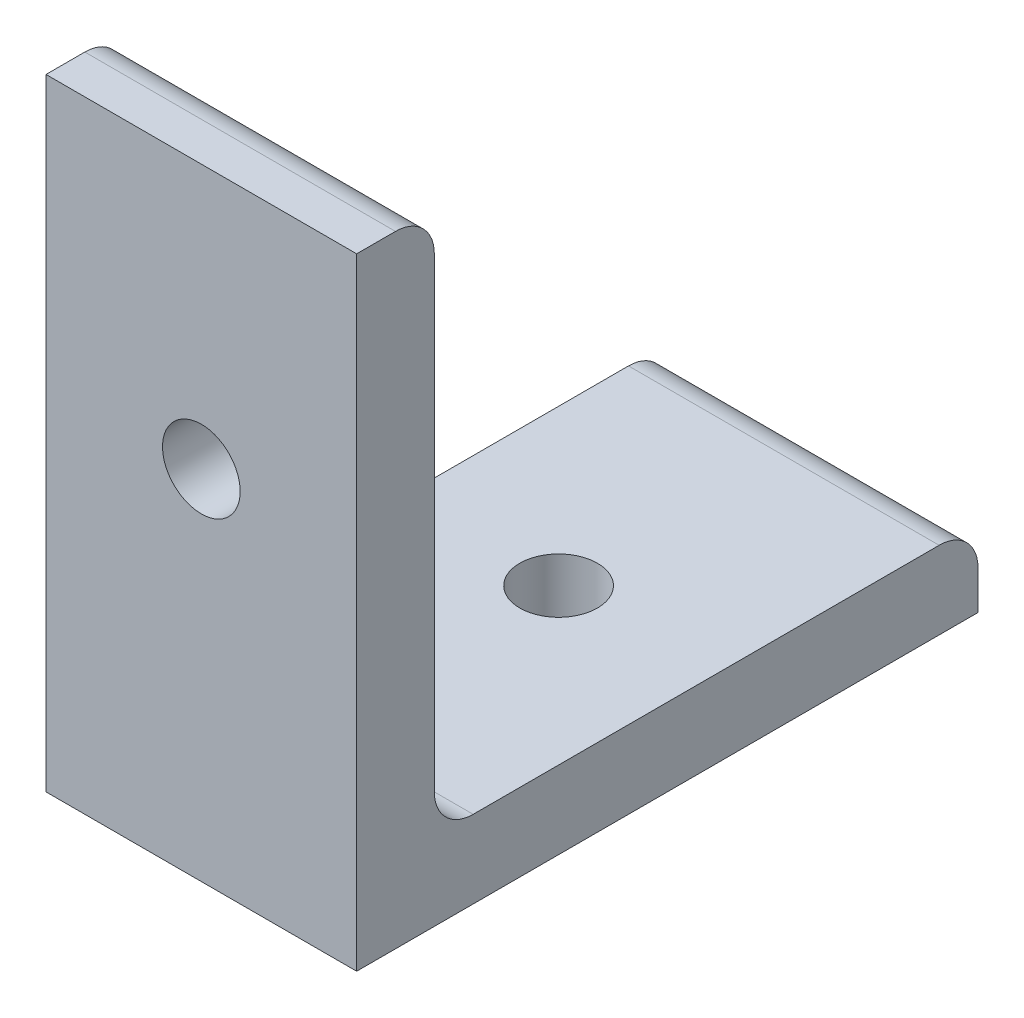
ISO-10303-21;
HEADER;
FILE_DESCRIPTION(('STEP AP214'),'2;1');
FILE_NAME('part.step','',(''),(''),'','','');
FILE_SCHEMA(('AUTOMOTIVE_DESIGN { 1 0 10303 214 1 1 1 1 }'));
ENDSEC;
DATA;
#1=APPLICATION_CONTEXT('core data for automotive mechanical design processes');
#2=APPLICATION_PROTOCOL_DEFINITION('international standard','automotive_design',2000,#1);
#3=PRODUCT_CONTEXT('',#1,'mechanical');
#4=PRODUCT('Part','Part','',(#3));
#5=PRODUCT_RELATED_PRODUCT_CATEGORY('part','',(#4));
#6=PRODUCT_DEFINITION_FORMATION('','',#4);
#7=PRODUCT_DEFINITION_CONTEXT('part definition',#1,'design');
#8=PRODUCT_DEFINITION('design','',#6,#7);
#9=PRODUCT_DEFINITION_SHAPE('','',#8);
#10=(LENGTH_UNIT() NAMED_UNIT(*) SI_UNIT(.MILLI.,.METRE.));
#11=(NAMED_UNIT(*) PLANE_ANGLE_UNIT() SI_UNIT($,.RADIAN.));
#12=(NAMED_UNIT(*) SI_UNIT($,.STERADIAN.) SOLID_ANGLE_UNIT());
#13=UNCERTAINTY_MEASURE_WITH_UNIT(LENGTH_MEASURE(1.E-05),#10,'distance_accuracy_value','');
#14=(GEOMETRIC_REPRESENTATION_CONTEXT(3) GLOBAL_UNCERTAINTY_ASSIGNED_CONTEXT((#13)) GLOBAL_UNIT_ASSIGNED_CONTEXT((#10,
#11,#12)) REPRESENTATION_CONTEXT('',''));
#15=CARTESIAN_POINT('',(0.,0.,0.));
#16=DIRECTION('',(0.,0.,1.));
#17=DIRECTION('',(1.,0.,0.));
#18=AXIS2_PLACEMENT_3D('',#15,#16,#17);
#19=CARTESIAN_POINT('',(25.4,50.8,0.));
#20=DIRECTION('',(0.,0.,-1.));
#21=DIRECTION('',(-1.,0.,0.));
#22=AXIS2_PLACEMENT_3D('',#19,#20,#21);
#23=PLANE('',#22);
#24=CARTESIAN_POINT('',(12.7,29.21,0.));
#25=DIRECTION('',(0.,0.,1.));
#26=DIRECTION('',(1.,0.,0.));
#27=AXIS2_PLACEMENT_3D('',#24,#25,#26);
#28=CIRCLE('',#27,3.175);
#29=CARTESIAN_POINT('',(15.875,29.21,0.));
#30=VERTEX_POINT('',#29);
#31=EDGE_CURVE('E187',#30,#30,#28,.T.);
#32=ORIENTED_EDGE('',*,*,#31,.F.);
#33=EDGE_LOOP('',(#32));
#34=FACE_BOUND('',#33,.T.);
#35=DIRECTION('',(0.,-1.,0.));
#36=VECTOR('',#35,1.);
#37=CARTESIAN_POINT('',(0.,50.8,0.));
#38=LINE('',#37,#36);
#39=CARTESIAN_POINT('',(0.,50.8,0.));
#40=VERTEX_POINT('',#39);
#41=CARTESIAN_POINT('',(0.,0.,0.));
#42=VERTEX_POINT('',#41);
#43=EDGE_CURVE('E125',#40,#42,#38,.T.);
#44=ORIENTED_EDGE('',*,*,#43,.T.);
#45=DIRECTION('',(-1.,0.,0.));
#46=VECTOR('',#45,1.);
#47=CARTESIAN_POINT('',(25.4,0.,0.));
#48=LINE('',#47,#46);
#49=CARTESIAN_POINT('',(25.4,0.,0.));
#50=VERTEX_POINT('',#49);
#51=EDGE_CURVE('E107',#50,#42,#48,.T.);
#52=ORIENTED_EDGE('',*,*,#51,.F.);
#53=DIRECTION('',(0.,-1.,0.));
#54=VECTOR('',#53,1.);
#55=CARTESIAN_POINT('',(25.4,50.8,0.));
#56=LINE('',#55,#54);
#57=CARTESIAN_POINT('',(25.4,50.8,0.));
#58=VERTEX_POINT('',#57);
#59=EDGE_CURVE('E112',#58,#50,#56,.T.);
#60=ORIENTED_EDGE('',*,*,#59,.F.);
#61=DIRECTION('',(-1.,0.,0.));
#62=VECTOR('',#61,1.);
#63=CARTESIAN_POINT('',(25.4,50.8,0.));
#64=LINE('',#63,#62);
#65=EDGE_CURVE('E131',#58,#40,#64,.T.);
#66=ORIENTED_EDGE('',*,*,#65,.T.);
#67=EDGE_LOOP('',(#44,#52,#60,#66));
#68=FACE_BOUND('',#67,.T.);
#69=ADVANCED_FACE('F32',(#34,#68),#23,.F.);
#70=CARTESIAN_POINT('',(25.4,0.,0.));
#71=DIRECTION('',(0.,1.,0.));
#72=DIRECTION('',(0.,0.,1.));
#73=AXIS2_PLACEMENT_3D('',#70,#71,#72);
#74=PLANE('',#73);
#75=CARTESIAN_POINT('',(12.7,0.,-29.21));
#76=DIRECTION('',(0.,1.,0.));
#77=DIRECTION('',(0.,0.,1.));
#78=AXIS2_PLACEMENT_3D('',#75,#76,#77);
#79=CIRCLE('',#78,3.175);
#80=CARTESIAN_POINT('',(12.7,0.,-26.035));
#81=VERTEX_POINT('',#80);
#82=EDGE_CURVE('E190',#81,#81,#79,.F.);
#83=ORIENTED_EDGE('',*,*,#82,.F.);
#84=EDGE_LOOP('',(#83));
#85=FACE_BOUND('',#84,.T.);
#86=DIRECTION('',(0.,0.,-1.));
#87=VECTOR('',#86,1.);
#88=CARTESIAN_POINT('',(0.,0.,0.));
#89=LINE('',#88,#87);
#90=CARTESIAN_POINT('',(0.,0.,-50.8));
#91=VERTEX_POINT('',#90);
#92=EDGE_CURVE('E172',#42,#91,#89,.T.);
#93=ORIENTED_EDGE('',*,*,#92,.T.);
#94=DIRECTION('',(-1.,0.,0.));
#95=VECTOR('',#94,1.);
#96=CARTESIAN_POINT('',(25.4,0.,-50.8));
#97=LINE('',#96,#95);
#98=CARTESIAN_POINT('',(25.4,0.,-50.8));
#99=VERTEX_POINT('',#98);
#100=EDGE_CURVE('E110',#99,#91,#97,.T.);
#101=ORIENTED_EDGE('',*,*,#100,.F.);
#102=DIRECTION('',(0.,0.,-1.));
#103=VECTOR('',#102,1.);
#104=CARTESIAN_POINT('',(25.4,0.,0.));
#105=LINE('',#104,#103);
#106=EDGE_CURVE('E103',#50,#99,#105,.T.);
#107=ORIENTED_EDGE('',*,*,#106,.F.);
#108=ORIENTED_EDGE('',*,*,#51,.T.);
#109=EDGE_LOOP('',(#93,#101,#107,#108));
#110=FACE_BOUND('',#109,.T.);
#111=ADVANCED_FACE('F105',(#85,#110),#74,.F.);
#112=CARTESIAN_POINT('',(25.4,0.,-50.8));
#113=DIRECTION('',(0.,0.,1.));
#114=DIRECTION('',(1.,0.,0.));
#115=AXIS2_PLACEMENT_3D('',#112,#113,#114);
#116=PLANE('',#115);
#117=DIRECTION('',(0.,1.,0.));
#118=VECTOR('',#117,1.);
#119=CARTESIAN_POINT('',(0.,0.,-50.8));
#120=LINE('',#119,#118);
#121=CARTESIAN_POINT('',(0.,3.175,-50.8));
#122=VERTEX_POINT('',#121);
#123=EDGE_CURVE('E168',#91,#122,#120,.T.);
#124=ORIENTED_EDGE('',*,*,#123,.T.);
#125=DIRECTION('',(-1.,0.,0.));
#126=VECTOR('',#125,1.);
#127=CARTESIAN_POINT('',(25.4,3.175,-50.8));
#128=LINE('',#127,#126);
#129=CARTESIAN_POINT('',(25.4,3.175,-50.8));
#130=VERTEX_POINT('',#129);
#131=EDGE_CURVE('E11',#122,#130,#128,.F.);
#132=ORIENTED_EDGE('',*,*,#131,.T.);
#133=DIRECTION('',(0.,1.,0.));
#134=VECTOR('',#133,1.);
#135=CARTESIAN_POINT('',(25.4,0.,-50.8));
#136=LINE('',#135,#134);
#137=EDGE_CURVE('E111',#99,#130,#136,.T.);
#138=ORIENTED_EDGE('',*,*,#137,.F.);
#139=ORIENTED_EDGE('',*,*,#100,.T.);
#140=EDGE_LOOP('',(#124,#132,#138,#139));
#141=FACE_BOUND('',#140,.T.);
#142=ADVANCED_FACE('F182',(#141),#116,.F.);
#143=CARTESIAN_POINT('',(25.4,6.35,-50.8));
#144=DIRECTION('',(0.,-1.,0.));
#145=DIRECTION('',(0.,0.,-1.));
#146=AXIS2_PLACEMENT_3D('',#143,#144,#145);
#147=PLANE('',#146);
#148=CARTESIAN_POINT('',(12.7,6.35,-29.21));
#149=DIRECTION('',(0.,1.,0.));
#150=DIRECTION('',(0.,0.,1.));
#151=AXIS2_PLACEMENT_3D('',#148,#149,#150);
#152=CIRCLE('',#151,3.175);
#153=CARTESIAN_POINT('',(12.7,6.35,-26.035));
#154=VERTEX_POINT('',#153);
#155=EDGE_CURVE('E193',#154,#154,#152,.T.);
#156=ORIENTED_EDGE('',*,*,#155,.F.);
#157=EDGE_LOOP('',(#156));
#158=FACE_BOUND('',#157,.T.);
#159=DIRECTION('',(0.,0.,1.));
#160=VECTOR('',#159,1.);
#161=CARTESIAN_POINT('',(25.4,6.35,-50.8));
#162=LINE('',#161,#160);
#163=CARTESIAN_POINT('',(25.4,6.35,-47.625));
#164=VERTEX_POINT('',#163);
#165=CARTESIAN_POINT('',(25.4,6.34999999999999,-9.52500000000001));
#166=VERTEX_POINT('',#165);
#167=EDGE_CURVE('E159',#164,#166,#162,.T.);
#168=ORIENTED_EDGE('',*,*,#167,.F.);
#169=DIRECTION('',(-1.,0.,0.));
#170=VECTOR('',#169,1.);
#171=CARTESIAN_POINT('',(25.4,6.35,-47.625));
#172=LINE('',#171,#170);
#173=CARTESIAN_POINT('',(0.,6.35,-47.625));
#174=VERTEX_POINT('',#173);
#175=EDGE_CURVE('E40',#164,#174,#172,.T.);
#176=ORIENTED_EDGE('',*,*,#175,.T.);
#177=DIRECTION('',(0.,0.,1.));
#178=VECTOR('',#177,1.);
#179=CARTESIAN_POINT('',(0.,6.35,-50.8));
#180=LINE('',#179,#178);
#181=CARTESIAN_POINT('',(0.,6.34999999999999,-9.52500000000001));
#182=VERTEX_POINT('',#181);
#183=EDGE_CURVE('E158',#174,#182,#180,.T.);
#184=ORIENTED_EDGE('',*,*,#183,.T.);
#185=DIRECTION('',(-1.,0.,0.));
#186=VECTOR('',#185,1.);
#187=CARTESIAN_POINT('',(25.4,6.34999999999999,-9.52500000000001));
#188=LINE('',#187,#186);
#189=EDGE_CURVE('E129',#182,#166,#188,.F.);
#190=ORIENTED_EDGE('',*,*,#189,.T.);
#191=EDGE_LOOP('',(#168,#176,#184,#190));
#192=FACE_BOUND('',#191,.T.);
#193=ADVANCED_FACE('F157',(#158,#192),#147,.F.);
#194=CARTESIAN_POINT('',(25.4,6.34999999999999,-6.35000000000001));
#195=DIRECTION('',(0.,0.,1.));
#196=DIRECTION('',(0.,-1.,0.));
#197=AXIS2_PLACEMENT_3D('',#194,#195,#196);
#198=PLANE('',#197);
#199=CARTESIAN_POINT('',(12.7,29.21,-6.35000000000001));
#200=DIRECTION('',(0.,0.,1.));
#201=DIRECTION('',(0.,-1.,0.));
#202=AXIS2_PLACEMENT_3D('',#199,#200,#201);
#203=CIRCLE('',#202,3.175);
#204=CARTESIAN_POINT('',(12.7,26.035,-6.35000000000001));
#205=VERTEX_POINT('',#204);
#206=EDGE_CURVE('E181',#205,#205,#203,.F.);
#207=ORIENTED_EDGE('',*,*,#206,.F.);
#208=EDGE_LOOP('',(#207));
#209=FACE_BOUND('',#208,.T.);
#210=DIRECTION('',(0.,1.,0.));
#211=VECTOR('',#210,1.);
#212=CARTESIAN_POINT('',(0.,6.34999999999999,-6.35000000000001));
#213=LINE('',#212,#211);
#214=CARTESIAN_POINT('',(0.,9.52499999999999,-6.35000000000001));
#215=VERTEX_POINT('',#214);
#216=CARTESIAN_POINT('',(0.,47.625,-6.35));
#217=VERTEX_POINT('',#216);
#218=EDGE_CURVE('E167',#215,#217,#213,.T.);
#219=ORIENTED_EDGE('',*,*,#218,.T.);
#220=DIRECTION('',(-1.,0.,0.));
#221=VECTOR('',#220,1.);
#222=CARTESIAN_POINT('',(25.4,47.625,-6.35));
#223=LINE('',#222,#221);
#224=CARTESIAN_POINT('',(25.4,47.625,-6.35));
#225=VERTEX_POINT('',#224);
#226=EDGE_CURVE('E149',#217,#225,#223,.F.);
#227=ORIENTED_EDGE('',*,*,#226,.T.);
#228=DIRECTION('',(0.,1.,0.));
#229=VECTOR('',#228,1.);
#230=CARTESIAN_POINT('',(25.4,6.34999999999999,-6.35000000000001));
#231=LINE('',#230,#229);
#232=CARTESIAN_POINT('',(25.4,9.52499999999999,-6.35000000000001));
#233=VERTEX_POINT('',#232);
#234=EDGE_CURVE('E176',#233,#225,#231,.T.);
#235=ORIENTED_EDGE('',*,*,#234,.F.);
#236=DIRECTION('',(-1.,0.,0.));
#237=VECTOR('',#236,1.);
#238=CARTESIAN_POINT('',(0.,9.52499999999999,-6.35000000000001));
#239=LINE('',#238,#237);
#240=EDGE_CURVE('E126',#233,#215,#239,.T.);
#241=ORIENTED_EDGE('',*,*,#240,.T.);
#242=EDGE_LOOP('',(#219,#227,#235,#241));
#243=FACE_BOUND('',#242,.T.);
#244=ADVANCED_FACE('F201',(#209,#243),#198,.F.);
#245=CARTESIAN_POINT('',(25.4,50.8,-6.35));
#246=DIRECTION('',(0.,-1.,0.));
#247=DIRECTION('',(0.,0.,-1.));
#248=AXIS2_PLACEMENT_3D('',#245,#246,#247);
#249=PLANE('',#248);
#250=DIRECTION('',(0.,0.,1.));
#251=VECTOR('',#250,1.);
#252=CARTESIAN_POINT('',(25.4,50.8,-6.35));
#253=LINE('',#252,#251);
#254=CARTESIAN_POINT('',(25.4,50.8,-3.17500000000001));
#255=VERTEX_POINT('',#254);
#256=EDGE_CURVE('E118',#255,#58,#253,.T.);
#257=ORIENTED_EDGE('',*,*,#256,.F.);
#258=DIRECTION('',(-1.,0.,0.));
#259=VECTOR('',#258,1.);
#260=CARTESIAN_POINT('',(25.4,50.8,-3.17500000000001));
#261=LINE('',#260,#259);
#262=CARTESIAN_POINT('',(0.,50.8,-3.17500000000001));
#263=VERTEX_POINT('',#262);
#264=EDGE_CURVE('E142',#255,#263,#261,.T.);
#265=ORIENTED_EDGE('',*,*,#264,.T.);
#266=DIRECTION('',(0.,0.,1.));
#267=VECTOR('',#266,1.);
#268=CARTESIAN_POINT('',(0.,50.8,-6.35));
#269=LINE('',#268,#267);
#270=EDGE_CURVE('E122',#263,#40,#269,.T.);
#271=ORIENTED_EDGE('',*,*,#270,.T.);
#272=ORIENTED_EDGE('',*,*,#65,.F.);
#273=EDGE_LOOP('',(#257,#265,#271,#272));
#274=FACE_BOUND('',#273,.T.);
#275=ADVANCED_FACE('F207',(#274),#249,.F.);
#276=CARTESIAN_POINT('',(25.4,0.,0.));
#277=DIRECTION('',(1.,0.,0.));
#278=DIRECTION('',(0.,0.,-1.));
#279=AXIS2_PLACEMENT_3D('',#276,#277,#278);
#280=PLANE('',#279);
#281=ORIENTED_EDGE('',*,*,#234,.T.);
#282=CARTESIAN_POINT('',(25.4,47.625,-3.17500000000001));
#283=DIRECTION('',(1.,0.,0.));
#284=DIRECTION('',(0.,0.,-1.));
#285=AXIS2_PLACEMENT_3D('',#282,#283,#284);
#286=CIRCLE('',#285,3.175);
#287=EDGE_CURVE('E152',#225,#255,#286,.T.);
#288=ORIENTED_EDGE('',*,*,#287,.T.);
#289=ORIENTED_EDGE('',*,*,#256,.T.);
#290=ORIENTED_EDGE('',*,*,#59,.T.);
#291=ORIENTED_EDGE('',*,*,#106,.T.);
#292=ORIENTED_EDGE('',*,*,#137,.T.);
#293=CARTESIAN_POINT('',(25.4,3.175,-47.625));
#294=DIRECTION('',(1.,0.,0.));
#295=DIRECTION('',(0.,0.,-1.));
#296=AXIS2_PLACEMENT_3D('',#293,#294,#295);
#297=CIRCLE('',#296,3.175);
#298=EDGE_CURVE('E47',#130,#164,#297,.T.);
#299=ORIENTED_EDGE('',*,*,#298,.T.);
#300=ORIENTED_EDGE('',*,*,#167,.T.);
#301=CARTESIAN_POINT('',(25.4,9.52499999999999,-9.52500000000001));
#302=DIRECTION('',(1.,0.,0.));
#303=DIRECTION('',(0.,0.,-1.));
#304=AXIS2_PLACEMENT_3D('',#301,#302,#303);
#305=CIRCLE('',#304,3.175);
#306=EDGE_CURVE('E140',#166,#233,#305,.F.);
#307=ORIENTED_EDGE('',*,*,#306,.T.);
#308=EDGE_LOOP('',(#281,#288,#289,#290,#291,#292,#299,#300,#307));
#309=FACE_BOUND('',#308,.T.);
#310=ADVANCED_FACE('F116',(#309),#280,.T.);
#311=CARTESIAN_POINT('',(0.,0.,0.));
#312=DIRECTION('',(1.,0.,0.));
#313=DIRECTION('',(0.,0.,-1.));
#314=AXIS2_PLACEMENT_3D('',#311,#312,#313);
#315=PLANE('',#314);
#316=ORIENTED_EDGE('',*,*,#270,.F.);
#317=CARTESIAN_POINT('',(0.,47.625,-3.17500000000001));
#318=DIRECTION('',(1.,0.,0.));
#319=DIRECTION('',(0.,0.,-1.));
#320=AXIS2_PLACEMENT_3D('',#317,#318,#319);
#321=CIRCLE('',#320,3.175);
#322=EDGE_CURVE('E147',#263,#217,#321,.F.);
#323=ORIENTED_EDGE('',*,*,#322,.T.);
#324=ORIENTED_EDGE('',*,*,#218,.F.);
#325=CARTESIAN_POINT('',(0.,9.52499999999999,-9.52500000000001));
#326=DIRECTION('',(1.,0.,0.));
#327=DIRECTION('',(0.,0.,-1.));
#328=AXIS2_PLACEMENT_3D('',#325,#326,#327);
#329=CIRCLE('',#328,3.175);
#330=EDGE_CURVE('E137',#215,#182,#329,.T.);
#331=ORIENTED_EDGE('',*,*,#330,.T.);
#332=ORIENTED_EDGE('',*,*,#183,.F.);
#333=CARTESIAN_POINT('',(0.,3.175,-47.625));
#334=DIRECTION('',(1.,0.,0.));
#335=DIRECTION('',(0.,0.,-1.));
#336=AXIS2_PLACEMENT_3D('',#333,#334,#335);
#337=CIRCLE('',#336,3.175);
#338=EDGE_CURVE('E145',#174,#122,#337,.F.);
#339=ORIENTED_EDGE('',*,*,#338,.T.);
#340=ORIENTED_EDGE('',*,*,#123,.F.);
#341=ORIENTED_EDGE('',*,*,#92,.F.);
#342=ORIENTED_EDGE('',*,*,#43,.F.);
#343=EDGE_LOOP('',(#316,#323,#324,#331,#332,#339,#340,#341,#342));
#344=FACE_BOUND('',#343,.T.);
#345=ADVANCED_FACE('F163',(#344),#315,.F.);
#346=CARTESIAN_POINT('',(12.7,29.21,-50.801));
#347=DIRECTION('',(0.,0.,1.));
#348=DIRECTION('',(1.,0.,0.));
#349=AXIS2_PLACEMENT_3D('',#346,#347,#348);
#350=CYLINDRICAL_SURFACE('',#349,3.175);
#351=ORIENTED_EDGE('',*,*,#31,.T.);
#352=EDGE_LOOP('',(#351));
#353=FACE_BOUND('',#352,.T.);
#354=ORIENTED_EDGE('',*,*,#206,.T.);
#355=EDGE_LOOP('',(#354));
#356=FACE_BOUND('',#355,.T.);
#357=ADVANCED_FACE('F246',(#353,#356),#350,.F.);
#358=CARTESIAN_POINT('',(12.7,-0.00100000000000273,-29.21));
#359=DIRECTION('',(0.,1.,0.));
#360=DIRECTION('',(0.,0.,1.));
#361=AXIS2_PLACEMENT_3D('',#358,#359,#360);
#362=CYLINDRICAL_SURFACE('',#361,3.175);
#363=CARTESIAN_POINT('',(12.7,6.35,-26.035));
#364=CARTESIAN_POINT('',(12.7,6.28385416666666,-26.035));
#365=CARTESIAN_POINT('',(12.7,6.21770833333333,-26.035));
#366=CARTESIAN_POINT('',(12.7,6.08541666666666,-26.035));
#367=CARTESIAN_POINT('',(12.7,6.01927083333333,-26.035));
#368=CARTESIAN_POINT('',(12.7,5.88697916666666,-26.035));
#369=CARTESIAN_POINT('',(12.7,5.82083333333333,-26.035));
#370=CARTESIAN_POINT('',(12.7,5.68854166666666,-26.035));
#371=CARTESIAN_POINT('',(12.7,5.62239583333333,-26.035));
#372=CARTESIAN_POINT('',(12.7,5.49010416666666,-26.035));
#373=CARTESIAN_POINT('',(12.7,5.42395833333333,-26.035));
#374=CARTESIAN_POINT('',(12.7,5.29166666666666,-26.035));
#375=CARTESIAN_POINT('',(12.7,5.22552083333333,-26.035));
#376=CARTESIAN_POINT('',(12.7,5.09322916666666,-26.035));
#377=CARTESIAN_POINT('',(12.7,5.02708333333333,-26.035));
#378=CARTESIAN_POINT('',(12.7,4.89479166666666,-26.035));
#379=CARTESIAN_POINT('',(12.7,4.82864583333333,-26.035));
#380=CARTESIAN_POINT('',(12.7,4.69635416666666,-26.035));
#381=CARTESIAN_POINT('',(12.7,4.63020833333333,-26.035));
#382=CARTESIAN_POINT('',(12.7,4.49791666666666,-26.035));
#383=CARTESIAN_POINT('',(12.7,4.43177083333333,-26.035));
#384=CARTESIAN_POINT('',(12.7,4.29947916666666,-26.035));
#385=CARTESIAN_POINT('',(12.7,4.23333333333333,-26.035));
#386=CARTESIAN_POINT('',(12.7,4.10104166666666,-26.035));
#387=CARTESIAN_POINT('',(12.7,4.03489583333333,-26.035));
#388=CARTESIAN_POINT('',(12.7,3.90260416666666,-26.035));
#389=CARTESIAN_POINT('',(12.7,3.83645833333333,-26.035));
#390=CARTESIAN_POINT('',(12.7,3.70416666666666,-26.035));
#391=CARTESIAN_POINT('',(12.7,3.63802083333333,-26.035));
#392=CARTESIAN_POINT('',(12.7,3.50572916666666,-26.035));
#393=CARTESIAN_POINT('',(12.7,3.43958333333333,-26.035));
#394=CARTESIAN_POINT('',(12.7,3.30729166666666,-26.035));
#395=CARTESIAN_POINT('',(12.7,3.24114583333333,-26.035));
#396=CARTESIAN_POINT('',(12.7,3.10885416666666,-26.035));
#397=CARTESIAN_POINT('',(12.7,3.04270833333333,-26.035));
#398=CARTESIAN_POINT('',(12.7,2.91041666666666,-26.035));
#399=CARTESIAN_POINT('',(12.7,2.84427083333333,-26.035));
#400=CARTESIAN_POINT('',(12.7,2.71197916666666,-26.035));
#401=CARTESIAN_POINT('',(12.7,2.64583333333333,-26.035));
#402=CARTESIAN_POINT('',(12.7,2.51354166666666,-26.035));
#403=CARTESIAN_POINT('',(12.7,2.44739583333333,-26.035));
#404=CARTESIAN_POINT('',(12.7,2.31510416666666,-26.035));
#405=CARTESIAN_POINT('',(12.7,2.24895833333333,-26.035));
#406=CARTESIAN_POINT('',(12.7,2.11666666666666,-26.035));
#407=CARTESIAN_POINT('',(12.7,2.05052083333333,-26.035));
#408=CARTESIAN_POINT('',(12.7,1.91822916666667,-26.035));
#409=CARTESIAN_POINT('',(12.7,1.85208333333333,-26.035));
#410=CARTESIAN_POINT('',(12.7,1.71979166666667,-26.035));
#411=CARTESIAN_POINT('',(12.7,1.65364583333333,-26.035));
#412=CARTESIAN_POINT('',(12.7,1.52135416666666,-26.035));
#413=CARTESIAN_POINT('',(12.7,1.45520833333333,-26.035));
#414=CARTESIAN_POINT('',(12.7,1.32291666666666,-26.035));
#415=CARTESIAN_POINT('',(12.7,1.25677083333333,-26.035));
#416=CARTESIAN_POINT('',(12.7,1.12447916666667,-26.035));
#417=CARTESIAN_POINT('',(12.7,1.05833333333333,-26.035));
#418=CARTESIAN_POINT('',(12.7,0.926041666666665,-26.035));
#419=CARTESIAN_POINT('',(12.7,0.859895833333332,-26.035));
#420=CARTESIAN_POINT('',(12.7,0.727604166666666,-26.035));
#421=CARTESIAN_POINT('',(12.7,0.661458333333332,-26.035));
#422=CARTESIAN_POINT('',(12.7,0.529166666666666,-26.035));
#423=CARTESIAN_POINT('',(12.7,0.463020833333332,-26.035));
#424=CARTESIAN_POINT('',(12.7,0.330729166666666,-26.035));
#425=CARTESIAN_POINT('',(12.7,0.264583333333333,-26.035));
#426=CARTESIAN_POINT('',(12.7,0.132291666666666,-26.035));
#427=CARTESIAN_POINT('',(12.7,0.0661458333333329,-26.035));
#428=CARTESIAN_POINT('',(12.7,0.,-26.035));
#429=B_SPLINE_CURVE_WITH_KNOTS('',3,(#363,#364,#365,#366,#367,#368,#369,#370,#371,#372,#373,
#374,#375,#376,#377,#378,#379,#380,#381,#382,#383,#384,#385,#386,#387,#388,#389,#390,#391,#392,
#393,#394,#395,#396,#397,#398,#399,#400,#401,#402,#403,#404,#405,#406,#407,#408,#409,#410,#411,
#412,#413,#414,#415,#416,#417,#418,#419,#420,#421,#422,#423,#424,#425,#426,#427,#428),
.UNSPECIFIED.,.F.,.F.,(4,2,2,2,2,2,2,2,2,2,2,2,2,2,2,2,2,2,2,2,2,2,2,2,2,2,2,2,2,2,2,2,4),(0.,
0.1984375,0.396875,0.595312499999999,0.793749999999999,0.992187499999999,1.190625,1.3890625,
1.5875,1.7859375,1.984375,2.1828125,2.38125,2.5796875,2.778125,2.9765625,3.175,3.3734375,
3.571875,3.7703125,3.96875,4.1671875,4.365625,4.5640625,4.7625,4.9609375,5.159375,5.3578125,
5.55625,5.7546875,5.953125,6.1515625,6.35),.UNSPECIFIED.);
#430=EDGE_CURVE('BSEAM197',#154,#81,#429,.T.);
#431=ORIENTED_EDGE('',*,*,#155,.T.);
#432=ORIENTED_EDGE('',*,*,#82,.T.);
#433=ORIENTED_EDGE('',*,*,#430,.T.);
#434=ORIENTED_EDGE('',*,*,#430,.F.);
#435=EDGE_LOOP('',(#431,#433,#432,#434));
#436=FACE_BOUND('',#435,.T.);
#437=ADVANCED_FACE('F197',(#436),#362,.F.);
#438=CARTESIAN_POINT('',(25.4,9.52499999999999,-9.52500000000001));
#439=DIRECTION('',(1.,0.,0.));
#440=DIRECTION('',(0.,0.,-1.));
#441=AXIS2_PLACEMENT_3D('',#438,#439,#440);
#442=CYLINDRICAL_SURFACE('',#441,3.175);
#443=ORIENTED_EDGE('',*,*,#306,.F.);
#444=ORIENTED_EDGE('',*,*,#189,.F.);
#445=ORIENTED_EDGE('',*,*,#330,.F.);
#446=ORIENTED_EDGE('',*,*,#240,.F.);
#447=EDGE_LOOP('',(#443,#444,#445,#446));
#448=FACE_BOUND('',#447,.T.);
#449=ADVANCED_FACE('F221',(#448),#442,.F.);
#450=CARTESIAN_POINT('',(25.4,47.625,-3.17500000000001));
#451=DIRECTION('',(-1.,0.,0.));
#452=DIRECTION('',(0.,0.,1.));
#453=AXIS2_PLACEMENT_3D('',#450,#451,#452);
#454=CYLINDRICAL_SURFACE('',#453,3.175);
#455=ORIENTED_EDGE('',*,*,#287,.F.);
#456=ORIENTED_EDGE('',*,*,#226,.F.);
#457=ORIENTED_EDGE('',*,*,#322,.F.);
#458=ORIENTED_EDGE('',*,*,#264,.F.);
#459=EDGE_LOOP('',(#455,#456,#457,#458));
#460=FACE_BOUND('',#459,.T.);
#461=ADVANCED_FACE('F223',(#460),#454,.T.);
#462=CARTESIAN_POINT('',(25.4,3.175,-47.625));
#463=DIRECTION('',(-1.,0.,0.));
#464=DIRECTION('',(0.,0.,1.));
#465=AXIS2_PLACEMENT_3D('',#462,#463,#464);
#466=CYLINDRICAL_SURFACE('',#465,3.175);
#467=ORIENTED_EDGE('',*,*,#298,.F.);
#468=ORIENTED_EDGE('',*,*,#131,.F.);
#469=ORIENTED_EDGE('',*,*,#338,.F.);
#470=ORIENTED_EDGE('',*,*,#175,.F.);
#471=EDGE_LOOP('',(#467,#468,#469,#470));
#472=FACE_BOUND('',#471,.T.);
#473=ADVANCED_FACE('F34',(#472),#466,.T.);
#474=CLOSED_SHELL('',(#69,#111,#142,#193,#244,#275,#310,#345,#357,#437,#449,#461,#473));
#475=MANIFOLD_SOLID_BREP('B2',#474);
#476=ADVANCED_BREP_SHAPE_REPRESENTATION('',(#18,#475),#14);
#477=SHAPE_DEFINITION_REPRESENTATION(#9,#476);
ENDSEC;
END-ISO-10303-21;
